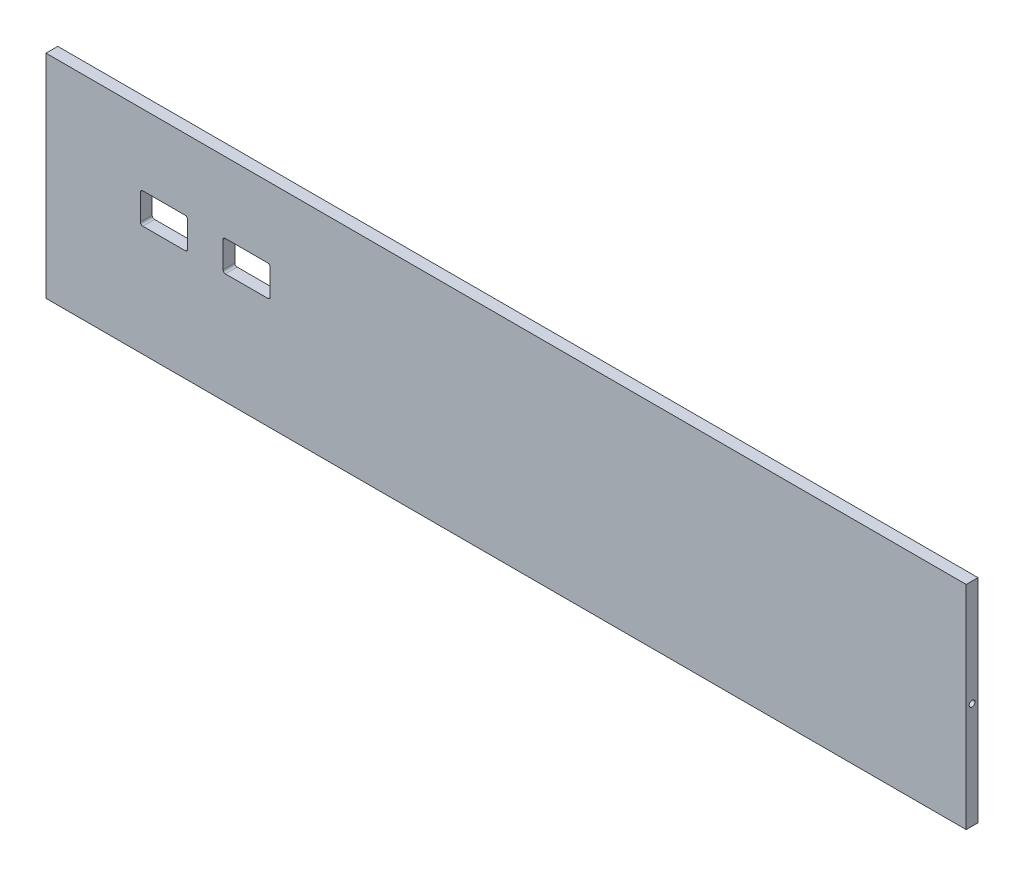
ISO-10303-21;
HEADER;
FILE_DESCRIPTION(('STEP AP214'),'2;1');
FILE_NAME('part.step','',(''),(''),'','','');
FILE_SCHEMA(('AUTOMOTIVE_DESIGN { 1 0 10303 214 1 1 1 1 }'));
ENDSEC;
DATA;
#1=APPLICATION_CONTEXT('core data for automotive mechanical design processes');
#2=APPLICATION_PROTOCOL_DEFINITION('international standard','automotive_design',2000,#1);
#3=PRODUCT_CONTEXT('',#1,'mechanical');
#4=PRODUCT('Part','Part','',(#3));
#5=PRODUCT_RELATED_PRODUCT_CATEGORY('part','',(#4));
#6=PRODUCT_DEFINITION_FORMATION('','',#4);
#7=PRODUCT_DEFINITION_CONTEXT('part definition',#1,'design');
#8=PRODUCT_DEFINITION('design','',#6,#7);
#9=PRODUCT_DEFINITION_SHAPE('','',#8);
#10=(LENGTH_UNIT() NAMED_UNIT(*) SI_UNIT(.MILLI.,.METRE.));
#11=(NAMED_UNIT(*) PLANE_ANGLE_UNIT() SI_UNIT($,.RADIAN.));
#12=(NAMED_UNIT(*) SI_UNIT($,.STERADIAN.) SOLID_ANGLE_UNIT());
#13=UNCERTAINTY_MEASURE_WITH_UNIT(LENGTH_MEASURE(1.E-05),#10,'distance_accuracy_value','');
#14=(GEOMETRIC_REPRESENTATION_CONTEXT(3) GLOBAL_UNCERTAINTY_ASSIGNED_CONTEXT((#13)) GLOBAL_UNIT_ASSIGNED_CONTEXT((#10,
#11,#12)) REPRESENTATION_CONTEXT('',''));
#15=CARTESIAN_POINT('',(0.,0.,0.));
#16=DIRECTION('',(0.,0.,1.));
#17=DIRECTION('',(1.,0.,0.));
#18=AXIS2_PLACEMENT_3D('',#15,#16,#17);
#19=CARTESIAN_POINT('',(0.,0.,5.));
#20=DIRECTION('',(0.,0.,-1.));
#21=DIRECTION('',(-1.,0.,0.));
#22=AXIS2_PLACEMENT_3D('',#19,#20,#21);
#23=PLANE('',#22);
#24=CARTESIAN_POINT('',(94.,48.,5.));
#25=DIRECTION('',(0.,0.,1.));
#26=DIRECTION('',(1.,0.,0.));
#27=AXIS2_PLACEMENT_3D('',#24,#25,#26);
#28=CIRCLE('',#27,1.);
#29=CARTESIAN_POINT('',(94.,47.,5.));
#30=VERTEX_POINT('',#29);
#31=CARTESIAN_POINT('',(95.,48.,5.));
#32=VERTEX_POINT('',#31);
#33=EDGE_CURVE('E268',#30,#32,#28,.T.);
#34=ORIENTED_EDGE('',*,*,#33,.F.);
#35=DIRECTION('',(1.,0.,0.));
#36=VECTOR('',#35,1.);
#37=CARTESIAN_POINT('',(76.,47.,5.));
#38=LINE('',#37,#36);
#39=CARTESIAN_POINT('',(76.,47.,5.));
#40=VERTEX_POINT('',#39);
#41=EDGE_CURVE('E291',#40,#30,#38,.T.);
#42=ORIENTED_EDGE('',*,*,#41,.F.);
#43=CARTESIAN_POINT('',(76.,48.,5.));
#44=DIRECTION('',(0.,0.,1.));
#45=DIRECTION('',(1.,0.,0.));
#46=AXIS2_PLACEMENT_3D('',#43,#44,#45);
#47=CIRCLE('',#46,1.);
#48=CARTESIAN_POINT('',(75.,48.,5.));
#49=VERTEX_POINT('',#48);
#50=EDGE_CURVE('E287',#49,#40,#47,.T.);
#51=ORIENTED_EDGE('',*,*,#50,.F.);
#52=DIRECTION('',(0.,-1.,0.));
#53=VECTOR('',#52,1.);
#54=CARTESIAN_POINT('',(75.,59.,5.));
#55=LINE('',#54,#53);
#56=CARTESIAN_POINT('',(75.,59.,5.));
#57=VERTEX_POINT('',#56);
#58=EDGE_CURVE('E284',#57,#49,#55,.T.);
#59=ORIENTED_EDGE('',*,*,#58,.F.);
#60=CARTESIAN_POINT('',(76.,59.,5.));
#61=DIRECTION('',(0.,0.,1.));
#62=DIRECTION('',(1.,0.,0.));
#63=AXIS2_PLACEMENT_3D('',#60,#61,#62);
#64=CIRCLE('',#63,1.);
#65=CARTESIAN_POINT('',(76.,60.,5.));
#66=VERTEX_POINT('',#65);
#67=EDGE_CURVE('E281',#66,#57,#64,.T.);
#68=ORIENTED_EDGE('',*,*,#67,.F.);
#69=DIRECTION('',(-1.,0.,0.));
#70=VECTOR('',#69,1.);
#71=CARTESIAN_POINT('',(76.,60.,5.));
#72=LINE('',#71,#70);
#73=CARTESIAN_POINT('',(94.,60.,5.));
#74=VERTEX_POINT('',#73);
#75=EDGE_CURVE('E278',#74,#66,#72,.T.);
#76=ORIENTED_EDGE('',*,*,#75,.F.);
#77=CARTESIAN_POINT('',(94.,59.,5.));
#78=DIRECTION('',(0.,0.,1.));
#79=DIRECTION('',(-1.,0.,0.));
#80=AXIS2_PLACEMENT_3D('',#77,#78,#79);
#81=CIRCLE('',#80,1.00000000000001);
#82=CARTESIAN_POINT('',(95.,59.,5.));
#83=VERTEX_POINT('',#82);
#84=EDGE_CURVE('E275',#83,#74,#81,.T.);
#85=ORIENTED_EDGE('',*,*,#84,.F.);
#86=DIRECTION('',(0.,1.,0.));
#87=VECTOR('',#86,1.);
#88=CARTESIAN_POINT('',(95.,59.,5.));
#89=LINE('',#88,#87);
#90=EDGE_CURVE('E271',#32,#83,#89,.T.);
#91=ORIENTED_EDGE('',*,*,#90,.F.);
#92=EDGE_LOOP('',(#34,#42,#51,#59,#68,#76,#85,#91));
#93=FACE_BOUND('',#92,.T.);
#94=DIRECTION('',(0.,-1.,0.));
#95=VECTOR('',#94,1.);
#96=CARTESIAN_POINT('',(0.,0.,5.));
#97=LINE('',#96,#95);
#98=CARTESIAN_POINT('',(0.,90.,5.));
#99=VERTEX_POINT('',#98);
#100=CARTESIAN_POINT('',(0.,0.,5.));
#101=VERTEX_POINT('',#100);
#102=EDGE_CURVE('E351',#99,#101,#97,.T.);
#103=ORIENTED_EDGE('',*,*,#102,.T.);
#104=DIRECTION('',(1.,0.,0.));
#105=VECTOR('',#104,1.);
#106=CARTESIAN_POINT('',(0.,0.,5.));
#107=LINE('',#106,#105);
#108=CARTESIAN_POINT('',(390.,0.,5.));
#109=VERTEX_POINT('',#108);
#110=EDGE_CURVE('E355',#101,#109,#107,.T.);
#111=ORIENTED_EDGE('',*,*,#110,.T.);
#112=DIRECTION('',(0.,1.,0.));
#113=VECTOR('',#112,1.);
#114=CARTESIAN_POINT('',(390.,0.,5.));
#115=LINE('',#114,#113);
#116=CARTESIAN_POINT('',(390.,90.,5.));
#117=VERTEX_POINT('',#116);
#118=EDGE_CURVE('E359',#109,#117,#115,.T.);
#119=ORIENTED_EDGE('',*,*,#118,.T.);
#120=DIRECTION('',(-1.,0.,0.));
#121=VECTOR('',#120,1.);
#122=CARTESIAN_POINT('',(0.,90.,5.));
#123=LINE('',#122,#121);
#124=EDGE_CURVE('E362',#117,#99,#123,.T.);
#125=ORIENTED_EDGE('',*,*,#124,.T.);
#126=EDGE_LOOP('',(#103,#111,#119,#125));
#127=FACE_BOUND('',#126,.T.);
#128=CARTESIAN_POINT('',(59.,59.,5.));
#129=DIRECTION('',(0.,0.,1.));
#130=DIRECTION('',(-1.,0.,0.));
#131=AXIS2_PLACEMENT_3D('',#128,#129,#130);
#132=CIRCLE('',#131,1.);
#133=CARTESIAN_POINT('',(60.,59.,5.));
#134=VERTEX_POINT('',#133);
#135=CARTESIAN_POINT('',(59.,60.,5.));
#136=VERTEX_POINT('',#135);
#137=EDGE_CURVE('E177',#134,#136,#132,.T.);
#138=ORIENTED_EDGE('',*,*,#137,.F.);
#139=DIRECTION('',(0.,1.,0.));
#140=VECTOR('',#139,1.);
#141=CARTESIAN_POINT('',(60.,59.,5.));
#142=LINE('',#141,#140);
#143=CARTESIAN_POINT('',(60.,48.,5.));
#144=VERTEX_POINT('',#143);
#145=EDGE_CURVE('E219',#144,#134,#142,.T.);
#146=ORIENTED_EDGE('',*,*,#145,.F.);
#147=CARTESIAN_POINT('',(59.,48.,5.));
#148=DIRECTION('',(0.,0.,1.));
#149=DIRECTION('',(1.,0.,0.));
#150=AXIS2_PLACEMENT_3D('',#147,#148,#149);
#151=CIRCLE('',#150,1.);
#152=CARTESIAN_POINT('',(59.,47.,5.));
#153=VERTEX_POINT('',#152);
#154=EDGE_CURVE('E216',#153,#144,#151,.T.);
#155=ORIENTED_EDGE('',*,*,#154,.F.);
#156=DIRECTION('',(1.,0.,0.));
#157=VECTOR('',#156,1.);
#158=CARTESIAN_POINT('',(41.,47.,5.));
#159=LINE('',#158,#157);
#160=CARTESIAN_POINT('',(41.,47.,5.));
#161=VERTEX_POINT('',#160);
#162=EDGE_CURVE('E213',#161,#153,#159,.T.);
#163=ORIENTED_EDGE('',*,*,#162,.F.);
#164=CARTESIAN_POINT('',(41.,48.,5.));
#165=DIRECTION('',(0.,0.,1.));
#166=DIRECTION('',(1.,0.,0.));
#167=AXIS2_PLACEMENT_3D('',#164,#165,#166);
#168=CIRCLE('',#167,1.);
#169=CARTESIAN_POINT('',(40.,48.,5.));
#170=VERTEX_POINT('',#169);
#171=EDGE_CURVE('E210',#170,#161,#168,.T.);
#172=ORIENTED_EDGE('',*,*,#171,.F.);
#173=DIRECTION('',(0.,-1.,0.));
#174=VECTOR('',#173,1.);
#175=CARTESIAN_POINT('',(40.,59.,5.));
#176=LINE('',#175,#174);
#177=CARTESIAN_POINT('',(40.,59.,5.));
#178=VERTEX_POINT('',#177);
#179=EDGE_CURVE('E204',#178,#170,#176,.T.);
#180=ORIENTED_EDGE('',*,*,#179,.F.);
#181=CARTESIAN_POINT('',(41.,59.,5.));
#182=DIRECTION('',(0.,0.,1.));
#183=DIRECTION('',(-1.,0.,0.));
#184=AXIS2_PLACEMENT_3D('',#181,#182,#183);
#185=CIRCLE('',#184,1.);
#186=CARTESIAN_POINT('',(41.,60.,5.));
#187=VERTEX_POINT('',#186);
#188=EDGE_CURVE('E200',#187,#178,#185,.T.);
#189=ORIENTED_EDGE('',*,*,#188,.F.);
#190=DIRECTION('',(-1.,0.,0.));
#191=VECTOR('',#190,1.);
#192=CARTESIAN_POINT('',(41.,60.,5.));
#193=LINE('',#192,#191);
#194=EDGE_CURVE('E186',#136,#187,#193,.T.);
#195=ORIENTED_EDGE('',*,*,#194,.F.);
#196=EDGE_LOOP('',(#138,#146,#155,#163,#172,#180,#189,#195));
#197=FACE_BOUND('',#196,.T.);
#198=ADVANCED_FACE('F39',(#93,#127,#197),#23,.F.);
#199=CARTESIAN_POINT('',(0.,0.,0.));
#200=DIRECTION('',(0.,0.,-1.));
#201=DIRECTION('',(-1.,0.,0.));
#202=AXIS2_PLACEMENT_3D('',#199,#200,#201);
#203=PLANE('',#202);
#204=DIRECTION('',(0.,-1.,0.));
#205=VECTOR('',#204,1.);
#206=CARTESIAN_POINT('',(0.,0.,0.));
#207=LINE('',#206,#205);
#208=CARTESIAN_POINT('',(0.,90.,0.));
#209=VERTEX_POINT('',#208);
#210=CARTESIAN_POINT('',(0.,0.,0.));
#211=VERTEX_POINT('',#210);
#212=EDGE_CURVE('E350',#209,#211,#207,.T.);
#213=ORIENTED_EDGE('',*,*,#212,.F.);
#214=DIRECTION('',(-1.,0.,0.));
#215=VECTOR('',#214,1.);
#216=CARTESIAN_POINT('',(0.,90.,0.));
#217=LINE('',#216,#215);
#218=CARTESIAN_POINT('',(390.,90.,0.));
#219=VERTEX_POINT('',#218);
#220=EDGE_CURVE('E356',#219,#209,#217,.T.);
#221=ORIENTED_EDGE('',*,*,#220,.F.);
#222=DIRECTION('',(0.,1.,0.));
#223=VECTOR('',#222,1.);
#224=CARTESIAN_POINT('',(390.,0.,0.));
#225=LINE('',#224,#223);
#226=CARTESIAN_POINT('',(390.,0.,0.));
#227=VERTEX_POINT('',#226);
#228=EDGE_CURVE('E372',#227,#219,#225,.T.);
#229=ORIENTED_EDGE('',*,*,#228,.F.);
#230=DIRECTION('',(1.,0.,0.));
#231=VECTOR('',#230,1.);
#232=CARTESIAN_POINT('',(0.,0.,0.));
#233=LINE('',#232,#231);
#234=EDGE_CURVE('E369',#211,#227,#233,.T.);
#235=ORIENTED_EDGE('',*,*,#234,.F.);
#236=EDGE_LOOP('',(#213,#221,#229,#235));
#237=FACE_BOUND('',#236,.T.);
#238=DIRECTION('',(1.,0.,0.));
#239=VECTOR('',#238,1.);
#240=CARTESIAN_POINT('',(76.,47.,0.));
#241=LINE('',#240,#239);
#242=CARTESIAN_POINT('',(76.,47.,0.));
#243=VERTEX_POINT('',#242);
#244=CARTESIAN_POINT('',(94.,47.,0.));
#245=VERTEX_POINT('',#244);
#246=EDGE_CURVE('E272',#243,#245,#241,.T.);
#247=ORIENTED_EDGE('',*,*,#246,.T.);
#248=CARTESIAN_POINT('',(94.,48.,0.));
#249=DIRECTION('',(0.,0.,1.));
#250=DIRECTION('',(1.,0.,0.));
#251=AXIS2_PLACEMENT_3D('',#248,#249,#250);
#252=CIRCLE('',#251,1.);
#253=CARTESIAN_POINT('',(95.,48.,0.));
#254=VERTEX_POINT('',#253);
#255=EDGE_CURVE('E195',#245,#254,#252,.T.);
#256=ORIENTED_EDGE('',*,*,#255,.T.);
#257=DIRECTION('',(0.,1.,0.));
#258=VECTOR('',#257,1.);
#259=CARTESIAN_POINT('',(95.,59.,0.));
#260=LINE('',#259,#258);
#261=CARTESIAN_POINT('',(95.,59.,0.));
#262=VERTEX_POINT('',#261);
#263=EDGE_CURVE('E298',#254,#262,#260,.T.);
#264=ORIENTED_EDGE('',*,*,#263,.T.);
#265=CARTESIAN_POINT('',(94.,59.,0.));
#266=DIRECTION('',(0.,0.,1.));
#267=DIRECTION('',(-1.,0.,0.));
#268=AXIS2_PLACEMENT_3D('',#265,#266,#267);
#269=CIRCLE('',#268,1.00000000000001);
#270=CARTESIAN_POINT('',(94.,60.,0.));
#271=VERTEX_POINT('',#270);
#272=EDGE_CURVE('E302',#262,#271,#269,.T.);
#273=ORIENTED_EDGE('',*,*,#272,.T.);
#274=DIRECTION('',(-1.,0.,0.));
#275=VECTOR('',#274,1.);
#276=CARTESIAN_POINT('',(76.,60.,0.));
#277=LINE('',#276,#275);
#278=CARTESIAN_POINT('',(76.,60.,0.));
#279=VERTEX_POINT('',#278);
#280=EDGE_CURVE('E306',#271,#279,#277,.T.);
#281=ORIENTED_EDGE('',*,*,#280,.T.);
#282=CARTESIAN_POINT('',(76.,59.,0.));
#283=DIRECTION('',(0.,0.,1.));
#284=DIRECTION('',(1.,0.,0.));
#285=AXIS2_PLACEMENT_3D('',#282,#283,#284);
#286=CIRCLE('',#285,1.);
#287=CARTESIAN_POINT('',(75.,59.,0.));
#288=VERTEX_POINT('',#287);
#289=EDGE_CURVE('E310',#279,#288,#286,.T.);
#290=ORIENTED_EDGE('',*,*,#289,.T.);
#291=DIRECTION('',(0.,-1.,0.));
#292=VECTOR('',#291,1.);
#293=CARTESIAN_POINT('',(75.,59.,0.));
#294=LINE('',#293,#292);
#295=CARTESIAN_POINT('',(75.,48.,0.));
#296=VERTEX_POINT('',#295);
#297=EDGE_CURVE('E314',#288,#296,#294,.T.);
#298=ORIENTED_EDGE('',*,*,#297,.T.);
#299=CARTESIAN_POINT('',(76.,48.,0.));
#300=DIRECTION('',(0.,0.,1.));
#301=DIRECTION('',(1.,0.,0.));
#302=AXIS2_PLACEMENT_3D('',#299,#300,#301);
#303=CIRCLE('',#302,1.);
#304=EDGE_CURVE('E318',#296,#243,#303,.T.);
#305=ORIENTED_EDGE('',*,*,#304,.T.);
#306=EDGE_LOOP('',(#247,#256,#264,#273,#281,#290,#298,#305));
#307=FACE_BOUND('',#306,.T.);
#308=DIRECTION('',(0.,1.,0.));
#309=VECTOR('',#308,1.);
#310=CARTESIAN_POINT('',(60.,59.,0.));
#311=LINE('',#310,#309);
#312=CARTESIAN_POINT('',(60.,48.,0.));
#313=VERTEX_POINT('',#312);
#314=CARTESIAN_POINT('',(60.,59.,0.));
#315=VERTEX_POINT('',#314);
#316=EDGE_CURVE('E187',#313,#315,#311,.T.);
#317=ORIENTED_EDGE('',*,*,#316,.T.);
#318=CARTESIAN_POINT('',(59.,59.,0.));
#319=DIRECTION('',(0.,0.,1.));
#320=DIRECTION('',(-1.,0.,0.));
#321=AXIS2_PLACEMENT_3D('',#318,#319,#320);
#322=CIRCLE('',#321,1.);
#323=CARTESIAN_POINT('',(59.,60.,0.));
#324=VERTEX_POINT('',#323);
#325=EDGE_CURVE('E63',#315,#324,#322,.T.);
#326=ORIENTED_EDGE('',*,*,#325,.T.);
#327=DIRECTION('',(-1.,0.,0.));
#328=VECTOR('',#327,1.);
#329=CARTESIAN_POINT('',(41.,60.,0.));
#330=LINE('',#329,#328);
#331=CARTESIAN_POINT('',(41.,60.,0.));
#332=VERTEX_POINT('',#331);
#333=EDGE_CURVE('E193',#324,#332,#330,.T.);
#334=ORIENTED_EDGE('',*,*,#333,.T.);
#335=CARTESIAN_POINT('',(41.,59.,0.));
#336=DIRECTION('',(0.,0.,1.));
#337=DIRECTION('',(-1.,0.,0.));
#338=AXIS2_PLACEMENT_3D('',#335,#336,#337);
#339=CIRCLE('',#338,1.);
#340=CARTESIAN_POINT('',(40.,59.,0.));
#341=VERTEX_POINT('',#340);
#342=EDGE_CURVE('E227',#332,#341,#339,.T.);
#343=ORIENTED_EDGE('',*,*,#342,.T.);
#344=DIRECTION('',(0.,-1.,0.));
#345=VECTOR('',#344,1.);
#346=CARTESIAN_POINT('',(40.,59.,0.));
#347=LINE('',#346,#345);
#348=CARTESIAN_POINT('',(40.,48.,0.));
#349=VERTEX_POINT('',#348);
#350=EDGE_CURVE('E231',#341,#349,#347,.T.);
#351=ORIENTED_EDGE('',*,*,#350,.T.);
#352=CARTESIAN_POINT('',(41.,48.,0.));
#353=DIRECTION('',(0.,0.,1.));
#354=DIRECTION('',(1.,0.,0.));
#355=AXIS2_PLACEMENT_3D('',#352,#353,#354);
#356=CIRCLE('',#355,1.);
#357=CARTESIAN_POINT('',(41.,47.,0.));
#358=VERTEX_POINT('',#357);
#359=EDGE_CURVE('E235',#349,#358,#356,.T.);
#360=ORIENTED_EDGE('',*,*,#359,.T.);
#361=DIRECTION('',(1.,0.,0.));
#362=VECTOR('',#361,1.);
#363=CARTESIAN_POINT('',(41.,47.,0.));
#364=LINE('',#363,#362);
#365=CARTESIAN_POINT('',(59.,47.,0.));
#366=VERTEX_POINT('',#365);
#367=EDGE_CURVE('E239',#358,#366,#364,.T.);
#368=ORIENTED_EDGE('',*,*,#367,.T.);
#369=CARTESIAN_POINT('',(59.,48.,0.));
#370=DIRECTION('',(0.,0.,1.));
#371=DIRECTION('',(1.,0.,0.));
#372=AXIS2_PLACEMENT_3D('',#369,#370,#371);
#373=CIRCLE('',#372,1.);
#374=EDGE_CURVE('E243',#366,#313,#373,.T.);
#375=ORIENTED_EDGE('',*,*,#374,.T.);
#376=EDGE_LOOP('',(#317,#326,#334,#343,#351,#360,#368,#375));
#377=FACE_BOUND('',#376,.T.);
#378=ADVANCED_FACE('F395',(#237,#307,#377),#203,.T.);
#379=CARTESIAN_POINT('',(0.,0.,5.));
#380=DIRECTION('',(1.,0.,0.));
#381=DIRECTION('',(0.,0.,-1.));
#382=AXIS2_PLACEMENT_3D('',#379,#380,#381);
#383=PLANE('',#382);
#384=CARTESIAN_POINT('',(0.,45.,2.5));
#385=DIRECTION('',(-1.,0.,0.));
#386=DIRECTION('',(0.,0.,1.));
#387=AXIS2_PLACEMENT_3D('',#384,#385,#386);
#388=CIRCLE('',#387,1.25);
#389=CARTESIAN_POINT('',(0.,45.,3.75));
#390=VERTEX_POINT('',#389);
#391=EDGE_CURVE('E716',#390,#390,#388,.T.);
#392=ORIENTED_EDGE('',*,*,#391,.F.);
#393=EDGE_LOOP('',(#392));
#394=FACE_BOUND('',#393,.T.);
#395=ORIENTED_EDGE('',*,*,#212,.T.);
#396=DIRECTION('',(0.,0.,-1.));
#397=VECTOR('',#396,1.);
#398=CARTESIAN_POINT('',(0.,0.,5.));
#399=LINE('',#398,#397);
#400=EDGE_CURVE('E11',#101,#211,#399,.T.);
#401=ORIENTED_EDGE('',*,*,#400,.F.);
#402=ORIENTED_EDGE('',*,*,#102,.F.);
#403=DIRECTION('',(0.,0.,-1.));
#404=VECTOR('',#403,1.);
#405=CARTESIAN_POINT('',(0.,90.,5.));
#406=LINE('',#405,#404);
#407=EDGE_CURVE('E365',#99,#209,#406,.T.);
#408=ORIENTED_EDGE('',*,*,#407,.T.);
#409=EDGE_LOOP('',(#395,#401,#402,#408));
#410=FACE_BOUND('',#409,.T.);
#411=ADVANCED_FACE('F41',(#394,#410),#383,.F.);
#412=CARTESIAN_POINT('',(0.,0.,5.));
#413=DIRECTION('',(0.,1.,0.));
#414=DIRECTION('',(0.,0.,1.));
#415=AXIS2_PLACEMENT_3D('',#412,#413,#414);
#416=PLANE('',#415);
#417=CARTESIAN_POINT('',(35.,0.,2.5));
#418=DIRECTION('',(0.,-1.,0.));
#419=DIRECTION('',(0.,0.,-1.));
#420=AXIS2_PLACEMENT_3D('',#417,#418,#419);
#421=CIRCLE('',#420,1.25);
#422=CARTESIAN_POINT('',(35.,0.,1.25));
#423=VERTEX_POINT('',#422);
#424=EDGE_CURVE('E696',#423,#423,#421,.T.);
#425=ORIENTED_EDGE('',*,*,#424,.F.);
#426=EDGE_LOOP('',(#425));
#427=FACE_BOUND('',#426,.T.);
#428=CARTESIAN_POINT('',(355.,0.,2.5));
#429=DIRECTION('',(0.,-1.,0.));
#430=DIRECTION('',(0.,0.,-1.));
#431=AXIS2_PLACEMENT_3D('',#428,#429,#430);
#432=CIRCLE('',#431,1.24999999999996);
#433=CARTESIAN_POINT('',(355.,0.,1.25000000000004));
#434=VERTEX_POINT('',#433);
#435=EDGE_CURVE('E710',#434,#434,#432,.T.);
#436=ORIENTED_EDGE('',*,*,#435,.F.);
#437=EDGE_LOOP('',(#436));
#438=FACE_BOUND('',#437,.T.);
#439=ORIENTED_EDGE('',*,*,#234,.T.);
#440=DIRECTION('',(0.,0.,-1.));
#441=VECTOR('',#440,1.);
#442=CARTESIAN_POINT('',(390.,0.,5.));
#443=LINE('',#442,#441);
#444=EDGE_CURVE('E48',#109,#227,#443,.T.);
#445=ORIENTED_EDGE('',*,*,#444,.F.);
#446=ORIENTED_EDGE('',*,*,#110,.F.);
#447=ORIENTED_EDGE('',*,*,#400,.T.);
#448=EDGE_LOOP('',(#439,#445,#446,#447));
#449=FACE_BOUND('',#448,.T.);
#450=ADVANCED_FACE('F405',(#427,#438,#449),#416,.F.);
#451=CARTESIAN_POINT('',(390.,0.,5.));
#452=DIRECTION('',(-1.,0.,0.));
#453=DIRECTION('',(0.,0.,1.));
#454=AXIS2_PLACEMENT_3D('',#451,#452,#453);
#455=PLANE('',#454);
#456=CARTESIAN_POINT('',(390.,45.,2.5));
#457=DIRECTION('',(1.,0.,0.));
#458=DIRECTION('',(0.,0.,-1.));
#459=AXIS2_PLACEMENT_3D('',#456,#457,#458);
#460=CIRCLE('',#459,1.25);
#461=CARTESIAN_POINT('',(390.,45.,1.25));
#462=VERTEX_POINT('',#461);
#463=EDGE_CURVE('E695',#462,#462,#460,.T.);
#464=ORIENTED_EDGE('',*,*,#463,.F.);
#465=EDGE_LOOP('',(#464));
#466=FACE_BOUND('',#465,.T.);
#467=ORIENTED_EDGE('',*,*,#228,.T.);
#468=DIRECTION('',(0.,0.,-1.));
#469=VECTOR('',#468,1.);
#470=CARTESIAN_POINT('',(390.,90.,5.));
#471=LINE('',#470,#469);
#472=EDGE_CURVE('E380',#117,#219,#471,.T.);
#473=ORIENTED_EDGE('',*,*,#472,.F.);
#474=ORIENTED_EDGE('',*,*,#118,.F.);
#475=ORIENTED_EDGE('',*,*,#444,.T.);
#476=EDGE_LOOP('',(#467,#473,#474,#475));
#477=FACE_BOUND('',#476,.T.);
#478=ADVANCED_FACE('F389',(#466,#477),#455,.F.);
#479=CARTESIAN_POINT('',(0.,90.,5.));
#480=DIRECTION('',(0.,-1.,0.));
#481=DIRECTION('',(0.,0.,-1.));
#482=AXIS2_PLACEMENT_3D('',#479,#480,#481);
#483=PLANE('',#482);
#484=ORIENTED_EDGE('',*,*,#220,.T.);
#485=ORIENTED_EDGE('',*,*,#407,.F.);
#486=ORIENTED_EDGE('',*,*,#124,.F.);
#487=ORIENTED_EDGE('',*,*,#472,.T.);
#488=EDGE_LOOP('',(#484,#485,#486,#487));
#489=FACE_BOUND('',#488,.T.);
#490=ADVANCED_FACE('F399',(#489),#483,.F.);
#491=CARTESIAN_POINT('',(94.,48.,5.));
#492=DIRECTION('',(0.,0.,-1.));
#493=DIRECTION('',(-1.,0.,0.));
#494=AXIS2_PLACEMENT_3D('',#491,#492,#493);
#495=CYLINDRICAL_SURFACE('',#494,1.);
#496=ORIENTED_EDGE('',*,*,#255,.F.);
#497=DIRECTION('',(0.,0.,-1.));
#498=VECTOR('',#497,1.);
#499=CARTESIAN_POINT('',(94.,47.,5.));
#500=LINE('',#499,#498);
#501=EDGE_CURVE('E294',#30,#245,#500,.T.);
#502=ORIENTED_EDGE('',*,*,#501,.F.);
#503=ORIENTED_EDGE('',*,*,#33,.T.);
#504=DIRECTION('',(0.,0.,-1.));
#505=VECTOR('',#504,1.);
#506=CARTESIAN_POINT('',(95.,48.,5.));
#507=LINE('',#506,#505);
#508=EDGE_CURVE('E346',#32,#254,#507,.T.);
#509=ORIENTED_EDGE('',*,*,#508,.T.);
#510=EDGE_LOOP('',(#496,#502,#503,#509));
#511=FACE_BOUND('',#510,.T.);
#512=ADVANCED_FACE('F426',(#511),#495,.F.);
#513=CARTESIAN_POINT('',(95.,59.,5.));
#514=DIRECTION('',(-1.,0.,0.));
#515=DIRECTION('',(0.,-1.,0.));
#516=AXIS2_PLACEMENT_3D('',#513,#514,#515);
#517=PLANE('',#516);
#518=ORIENTED_EDGE('',*,*,#263,.F.);
#519=ORIENTED_EDGE('',*,*,#508,.F.);
#520=ORIENTED_EDGE('',*,*,#90,.T.);
#521=DIRECTION('',(0.,0.,-1.));
#522=VECTOR('',#521,1.);
#523=CARTESIAN_POINT('',(95.,59.,5.));
#524=LINE('',#523,#522);
#525=EDGE_CURVE('E343',#83,#262,#524,.T.);
#526=ORIENTED_EDGE('',*,*,#525,.T.);
#527=EDGE_LOOP('',(#518,#519,#520,#526));
#528=FACE_BOUND('',#527,.T.);
#529=ADVANCED_FACE('F433',(#528),#517,.T.);
#530=CARTESIAN_POINT('',(94.,59.,5.));
#531=DIRECTION('',(0.,0.,-1.));
#532=DIRECTION('',(-1.,0.,0.));
#533=AXIS2_PLACEMENT_3D('',#530,#531,#532);
#534=CYLINDRICAL_SURFACE('',#533,1.00000000000001);
#535=ORIENTED_EDGE('',*,*,#272,.F.);
#536=ORIENTED_EDGE('',*,*,#525,.F.);
#537=ORIENTED_EDGE('',*,*,#84,.T.);
#538=DIRECTION('',(0.,0.,-1.));
#539=VECTOR('',#538,1.);
#540=CARTESIAN_POINT('',(94.,60.,5.));
#541=LINE('',#540,#539);
#542=EDGE_CURVE('E340',#74,#271,#541,.T.);
#543=ORIENTED_EDGE('',*,*,#542,.T.);
#544=EDGE_LOOP('',(#535,#536,#537,#543));
#545=FACE_BOUND('',#544,.T.);
#546=ADVANCED_FACE('F438',(#545),#534,.F.);
#547=CARTESIAN_POINT('',(76.,60.,5.));
#548=DIRECTION('',(0.,-1.,0.));
#549=DIRECTION('',(0.,0.,-1.));
#550=AXIS2_PLACEMENT_3D('',#547,#548,#549);
#551=PLANE('',#550);
#552=ORIENTED_EDGE('',*,*,#280,.F.);
#553=ORIENTED_EDGE('',*,*,#542,.F.);
#554=ORIENTED_EDGE('',*,*,#75,.T.);
#555=DIRECTION('',(0.,0.,-1.));
#556=VECTOR('',#555,1.);
#557=CARTESIAN_POINT('',(76.,60.,5.));
#558=LINE('',#557,#556);
#559=EDGE_CURVE('E337',#66,#279,#558,.T.);
#560=ORIENTED_EDGE('',*,*,#559,.T.);
#561=EDGE_LOOP('',(#552,#553,#554,#560));
#562=FACE_BOUND('',#561,.T.);
#563=ADVANCED_FACE('F463',(#562),#551,.T.);
#564=CARTESIAN_POINT('',(76.,59.,5.));
#565=DIRECTION('',(0.,0.,-1.));
#566=DIRECTION('',(-1.,0.,0.));
#567=AXIS2_PLACEMENT_3D('',#564,#565,#566);
#568=CYLINDRICAL_SURFACE('',#567,1.);
#569=ORIENTED_EDGE('',*,*,#289,.F.);
#570=ORIENTED_EDGE('',*,*,#559,.F.);
#571=ORIENTED_EDGE('',*,*,#67,.T.);
#572=DIRECTION('',(0.,0.,-1.));
#573=VECTOR('',#572,1.);
#574=CARTESIAN_POINT('',(75.,59.,5.));
#575=LINE('',#574,#573);
#576=EDGE_CURVE('E334',#57,#288,#575,.T.);
#577=ORIENTED_EDGE('',*,*,#576,.T.);
#578=EDGE_LOOP('',(#569,#570,#571,#577));
#579=FACE_BOUND('',#578,.T.);
#580=ADVANCED_FACE('F468',(#579),#568,.F.);
#581=CARTESIAN_POINT('',(75.,59.,5.));
#582=DIRECTION('',(1.,0.,0.));
#583=DIRECTION('',(0.,0.,-1.));
#584=AXIS2_PLACEMENT_3D('',#581,#582,#583);
#585=PLANE('',#584);
#586=ORIENTED_EDGE('',*,*,#297,.F.);
#587=ORIENTED_EDGE('',*,*,#576,.F.);
#588=ORIENTED_EDGE('',*,*,#58,.T.);
#589=DIRECTION('',(0.,0.,-1.));
#590=VECTOR('',#589,1.);
#591=CARTESIAN_POINT('',(75.,48.,5.));
#592=LINE('',#591,#590);
#593=EDGE_CURVE('E331',#49,#296,#592,.T.);
#594=ORIENTED_EDGE('',*,*,#593,.T.);
#595=EDGE_LOOP('',(#586,#587,#588,#594));
#596=FACE_BOUND('',#595,.T.);
#597=ADVANCED_FACE('F471',(#596),#585,.T.);
#598=CARTESIAN_POINT('',(76.,48.,5.));
#599=DIRECTION('',(0.,0.,-1.));
#600=DIRECTION('',(-1.,0.,0.));
#601=AXIS2_PLACEMENT_3D('',#598,#599,#600);
#602=CYLINDRICAL_SURFACE('',#601,1.);
#603=ORIENTED_EDGE('',*,*,#304,.F.);
#604=ORIENTED_EDGE('',*,*,#593,.F.);
#605=ORIENTED_EDGE('',*,*,#50,.T.);
#606=DIRECTION('',(0.,0.,-1.));
#607=VECTOR('',#606,1.);
#608=CARTESIAN_POINT('',(76.,47.,5.));
#609=LINE('',#608,#607);
#610=EDGE_CURVE('E328',#40,#243,#609,.T.);
#611=ORIENTED_EDGE('',*,*,#610,.T.);
#612=EDGE_LOOP('',(#603,#604,#605,#611));
#613=FACE_BOUND('',#612,.T.);
#614=ADVANCED_FACE('F451',(#613),#602,.F.);
#615=CARTESIAN_POINT('',(76.,47.,5.));
#616=DIRECTION('',(0.,1.,0.));
#617=DIRECTION('',(0.,0.,1.));
#618=AXIS2_PLACEMENT_3D('',#615,#616,#617);
#619=PLANE('',#618);
#620=ORIENTED_EDGE('',*,*,#246,.F.);
#621=ORIENTED_EDGE('',*,*,#610,.F.);
#622=ORIENTED_EDGE('',*,*,#41,.T.);
#623=ORIENTED_EDGE('',*,*,#501,.T.);
#624=EDGE_LOOP('',(#620,#621,#622,#623));
#625=FACE_BOUND('',#624,.T.);
#626=ADVANCED_FACE('F444',(#625),#619,.T.);
#627=CARTESIAN_POINT('',(59.,59.,5.));
#628=DIRECTION('',(0.,0.,-1.));
#629=DIRECTION('',(-1.,0.,0.));
#630=AXIS2_PLACEMENT_3D('',#627,#628,#629);
#631=CYLINDRICAL_SURFACE('',#630,1.);
#632=ORIENTED_EDGE('',*,*,#325,.F.);
#633=DIRECTION('',(0.,0.,-1.));
#634=VECTOR('',#633,1.);
#635=CARTESIAN_POINT('',(60.,59.,5.));
#636=LINE('',#635,#634);
#637=EDGE_CURVE('E181',#134,#315,#636,.T.);
#638=ORIENTED_EDGE('',*,*,#637,.F.);
#639=ORIENTED_EDGE('',*,*,#137,.T.);
#640=DIRECTION('',(0.,0.,-1.));
#641=VECTOR('',#640,1.);
#642=CARTESIAN_POINT('',(59.,60.,5.));
#643=LINE('',#642,#641);
#644=EDGE_CURVE('E180',#136,#324,#643,.T.);
#645=ORIENTED_EDGE('',*,*,#644,.T.);
#646=EDGE_LOOP('',(#632,#638,#639,#645));
#647=FACE_BOUND('',#646,.T.);
#648=ADVANCED_FACE('F179',(#647),#631,.F.);
#649=CARTESIAN_POINT('',(41.,60.,5.));
#650=DIRECTION('',(0.,-1.,0.));
#651=DIRECTION('',(0.,0.,-1.));
#652=AXIS2_PLACEMENT_3D('',#649,#650,#651);
#653=PLANE('',#652);
#654=ORIENTED_EDGE('',*,*,#333,.F.);
#655=ORIENTED_EDGE('',*,*,#644,.F.);
#656=ORIENTED_EDGE('',*,*,#194,.T.);
#657=DIRECTION('',(0.,0.,-1.));
#658=VECTOR('',#657,1.);
#659=CARTESIAN_POINT('',(41.,60.,5.));
#660=LINE('',#659,#658);
#661=EDGE_CURVE('E196',#187,#332,#660,.T.);
#662=ORIENTED_EDGE('',*,*,#661,.T.);
#663=EDGE_LOOP('',(#654,#655,#656,#662));
#664=FACE_BOUND('',#663,.T.);
#665=ADVANCED_FACE('F190',(#664),#653,.T.);
#666=CARTESIAN_POINT('',(41.,59.,5.));
#667=DIRECTION('',(0.,0.,-1.));
#668=DIRECTION('',(-1.,0.,0.));
#669=AXIS2_PLACEMENT_3D('',#666,#667,#668);
#670=CYLINDRICAL_SURFACE('',#669,1.);
#671=ORIENTED_EDGE('',*,*,#342,.F.);
#672=ORIENTED_EDGE('',*,*,#661,.F.);
#673=ORIENTED_EDGE('',*,*,#188,.T.);
#674=DIRECTION('',(0.,0.,-1.));
#675=VECTOR('',#674,1.);
#676=CARTESIAN_POINT('',(40.,59.,5.));
#677=LINE('',#676,#675);
#678=EDGE_CURVE('E263',#178,#341,#677,.T.);
#679=ORIENTED_EDGE('',*,*,#678,.T.);
#680=EDGE_LOOP('',(#671,#672,#673,#679));
#681=FACE_BOUND('',#680,.T.);
#682=ADVANCED_FACE('F531',(#681),#670,.F.);
#683=CARTESIAN_POINT('',(40.,59.,5.));
#684=DIRECTION('',(1.,0.,0.));
#685=DIRECTION('',(0.,0.,-1.));
#686=AXIS2_PLACEMENT_3D('',#683,#684,#685);
#687=PLANE('',#686);
#688=ORIENTED_EDGE('',*,*,#350,.F.);
#689=ORIENTED_EDGE('',*,*,#678,.F.);
#690=ORIENTED_EDGE('',*,*,#179,.T.);
#691=DIRECTION('',(0.,0.,-1.));
#692=VECTOR('',#691,1.);
#693=CARTESIAN_POINT('',(40.,48.,5.));
#694=LINE('',#693,#692);
#695=EDGE_CURVE('E260',#170,#349,#694,.T.);
#696=ORIENTED_EDGE('',*,*,#695,.T.);
#697=EDGE_LOOP('',(#688,#689,#690,#696));
#698=FACE_BOUND('',#697,.T.);
#699=ADVANCED_FACE('F540',(#698),#687,.T.);
#700=CARTESIAN_POINT('',(41.,48.,5.));
#701=DIRECTION('',(0.,0.,-1.));
#702=DIRECTION('',(-1.,0.,0.));
#703=AXIS2_PLACEMENT_3D('',#700,#701,#702);
#704=CYLINDRICAL_SURFACE('',#703,1.);
#705=ORIENTED_EDGE('',*,*,#359,.F.);
#706=ORIENTED_EDGE('',*,*,#695,.F.);
#707=ORIENTED_EDGE('',*,*,#171,.T.);
#708=DIRECTION('',(0.,0.,-1.));
#709=VECTOR('',#708,1.);
#710=CARTESIAN_POINT('',(41.,47.,5.));
#711=LINE('',#710,#709);
#712=EDGE_CURVE('E257',#161,#358,#711,.T.);
#713=ORIENTED_EDGE('',*,*,#712,.T.);
#714=EDGE_LOOP('',(#705,#706,#707,#713));
#715=FACE_BOUND('',#714,.T.);
#716=ADVANCED_FACE('F550',(#715),#704,.F.);
#717=CARTESIAN_POINT('',(41.,47.,5.));
#718=DIRECTION('',(0.,1.,0.));
#719=DIRECTION('',(0.,0.,1.));
#720=AXIS2_PLACEMENT_3D('',#717,#718,#719);
#721=PLANE('',#720);
#722=ORIENTED_EDGE('',*,*,#367,.F.);
#723=ORIENTED_EDGE('',*,*,#712,.F.);
#724=ORIENTED_EDGE('',*,*,#162,.T.);
#725=DIRECTION('',(0.,0.,-1.));
#726=VECTOR('',#725,1.);
#727=CARTESIAN_POINT('',(59.,47.,5.));
#728=LINE('',#727,#726);
#729=EDGE_CURVE('E254',#153,#366,#728,.T.);
#730=ORIENTED_EDGE('',*,*,#729,.T.);
#731=EDGE_LOOP('',(#722,#723,#724,#730));
#732=FACE_BOUND('',#731,.T.);
#733=ADVANCED_FACE('F560',(#732),#721,.T.);
#734=CARTESIAN_POINT('',(59.,48.,5.));
#735=DIRECTION('',(0.,0.,-1.));
#736=DIRECTION('',(-1.,0.,0.));
#737=AXIS2_PLACEMENT_3D('',#734,#735,#736);
#738=CYLINDRICAL_SURFACE('',#737,1.);
#739=ORIENTED_EDGE('',*,*,#374,.F.);
#740=ORIENTED_EDGE('',*,*,#729,.F.);
#741=ORIENTED_EDGE('',*,*,#154,.T.);
#742=DIRECTION('',(0.,0.,-1.));
#743=VECTOR('',#742,1.);
#744=CARTESIAN_POINT('',(60.,48.,5.));
#745=LINE('',#744,#743);
#746=EDGE_CURVE('E55',#144,#313,#745,.T.);
#747=ORIENTED_EDGE('',*,*,#746,.T.);
#748=EDGE_LOOP('',(#739,#740,#741,#747));
#749=FACE_BOUND('',#748,.T.);
#750=ADVANCED_FACE('F570',(#749),#738,.F.);
#751=CARTESIAN_POINT('',(60.,59.,5.));
#752=DIRECTION('',(-1.,0.,0.));
#753=DIRECTION('',(0.,0.,1.));
#754=AXIS2_PLACEMENT_3D('',#751,#752,#753);
#755=PLANE('',#754);
#756=ORIENTED_EDGE('',*,*,#316,.F.);
#757=ORIENTED_EDGE('',*,*,#746,.F.);
#758=ORIENTED_EDGE('',*,*,#145,.T.);
#759=ORIENTED_EDGE('',*,*,#637,.T.);
#760=EDGE_LOOP('',(#756,#757,#758,#759));
#761=FACE_BOUND('',#760,.T.);
#762=ADVANCED_FACE('F580',(#761),#755,.T.);
#763=CARTESIAN_POINT('',(15.,45.,2.5));
#764=DIRECTION('',(-1.,0.,0.));
#765=DIRECTION('',(0.,0.,1.));
#766=AXIS2_PLACEMENT_3D('',#763,#764,#765);
#767=CYLINDRICAL_SURFACE('',#766,1.25);
#768=CARTESIAN_POINT('',(15.,45.,2.5));
#769=DIRECTION('',(-1.,0.,0.));
#770=DIRECTION('',(0.,0.,1.));
#771=AXIS2_PLACEMENT_3D('',#768,#769,#770);
#772=CIRCLE('',#771,1.25);
#773=CARTESIAN_POINT('',(15.,45.,3.75));
#774=VERTEX_POINT('',#773);
#775=EDGE_CURVE('E224',#774,#774,#772,.T.);
#776=ORIENTED_EDGE('',*,*,#775,.F.);
#777=EDGE_LOOP('',(#776));
#778=FACE_BOUND('',#777,.T.);
#779=ORIENTED_EDGE('',*,*,#391,.T.);
#780=EDGE_LOOP('',(#779));
#781=FACE_BOUND('',#780,.T.);
#782=ADVANCED_FACE('F590',(#778,#781),#767,.F.);
#783=CARTESIAN_POINT('',(15.,45.,2.5));
#784=DIRECTION('',(-1.,0.,0.));
#785=DIRECTION('',(0.,0.,1.));
#786=AXIS2_PLACEMENT_3D('',#783,#784,#785);
#787=PLANE('',#786);
#788=ORIENTED_EDGE('',*,*,#775,.T.);
#789=EDGE_LOOP('',(#788));
#790=FACE_BOUND('',#789,.T.);
#791=ADVANCED_FACE('F607',(#790),#787,.T.);
#792=CARTESIAN_POINT('',(375.,45.,2.5));
#793=DIRECTION('',(1.,0.,0.));
#794=DIRECTION('',(0.,0.,-1.));
#795=AXIS2_PLACEMENT_3D('',#792,#793,#794);
#796=CYLINDRICAL_SURFACE('',#795,1.25);
#797=CARTESIAN_POINT('',(375.,45.,2.5));
#798=DIRECTION('',(1.,0.,0.));
#799=DIRECTION('',(0.,0.,-1.));
#800=AXIS2_PLACEMENT_3D('',#797,#798,#799);
#801=CIRCLE('',#800,1.25);
#802=CARTESIAN_POINT('',(375.,45.,1.25));
#803=VERTEX_POINT('',#802);
#804=EDGE_CURVE('E701',#803,#803,#801,.T.);
#805=ORIENTED_EDGE('',*,*,#804,.F.);
#806=EDGE_LOOP('',(#805));
#807=FACE_BOUND('',#806,.T.);
#808=ORIENTED_EDGE('',*,*,#463,.T.);
#809=EDGE_LOOP('',(#808));
#810=FACE_BOUND('',#809,.T.);
#811=ADVANCED_FACE('F617',(#807,#810),#796,.F.);
#812=CARTESIAN_POINT('',(375.,45.,2.5));
#813=DIRECTION('',(1.,0.,0.));
#814=DIRECTION('',(0.,0.,-1.));
#815=AXIS2_PLACEMENT_3D('',#812,#813,#814);
#816=PLANE('',#815);
#817=ORIENTED_EDGE('',*,*,#804,.T.);
#818=EDGE_LOOP('',(#817));
#819=FACE_BOUND('',#818,.T.);
#820=ADVANCED_FACE('F634',(#819),#816,.T.);
#821=CARTESIAN_POINT('',(355.,15.,2.5));
#822=DIRECTION('',(0.,-1.,0.));
#823=DIRECTION('',(0.,0.,-1.));
#824=AXIS2_PLACEMENT_3D('',#821,#822,#823);
#825=CYLINDRICAL_SURFACE('',#824,1.24999999999996);
#826=CARTESIAN_POINT('',(355.,15.,2.5));
#827=DIRECTION('',(0.,-1.,0.));
#828=DIRECTION('',(0.,0.,-1.));
#829=AXIS2_PLACEMENT_3D('',#826,#827,#828);
#830=CIRCLE('',#829,1.24999999999996);
#831=CARTESIAN_POINT('',(355.,15.,1.25000000000004));
#832=VERTEX_POINT('',#831);
#833=EDGE_CURVE('E704',#832,#832,#830,.T.);
#834=ORIENTED_EDGE('',*,*,#833,.F.);
#835=EDGE_LOOP('',(#834));
#836=FACE_BOUND('',#835,.T.);
#837=ORIENTED_EDGE('',*,*,#435,.T.);
#838=EDGE_LOOP('',(#837));
#839=FACE_BOUND('',#838,.T.);
#840=ADVANCED_FACE('F643',(#836,#839),#825,.F.);
#841=CARTESIAN_POINT('',(355.,15.,2.5));
#842=DIRECTION('',(0.,-1.,0.));
#843=DIRECTION('',(0.,0.,-1.));
#844=AXIS2_PLACEMENT_3D('',#841,#842,#843);
#845=PLANE('',#844);
#846=ORIENTED_EDGE('',*,*,#833,.T.);
#847=EDGE_LOOP('',(#846));
#848=FACE_BOUND('',#847,.T.);
#849=ADVANCED_FACE('F657',(#848),#845,.T.);
#850=CARTESIAN_POINT('',(35.,15.,2.5));
#851=DIRECTION('',(0.,-1.,0.));
#852=DIRECTION('',(0.,0.,-1.));
#853=AXIS2_PLACEMENT_3D('',#850,#851,#852);
#854=CYLINDRICAL_SURFACE('',#853,1.25);
#855=CARTESIAN_POINT('',(35.,15.,2.5));
#856=DIRECTION('',(0.,-1.,0.));
#857=DIRECTION('',(0.,0.,-1.));
#858=AXIS2_PLACEMENT_3D('',#855,#856,#857);
#859=CIRCLE('',#858,1.25);
#860=CARTESIAN_POINT('',(35.,15.,1.25));
#861=VERTEX_POINT('',#860);
#862=EDGE_CURVE('E693',#861,#861,#859,.T.);
#863=ORIENTED_EDGE('',*,*,#862,.F.);
#864=EDGE_LOOP('',(#863));
#865=FACE_BOUND('',#864,.T.);
#866=ORIENTED_EDGE('',*,*,#424,.T.);
#867=EDGE_LOOP('',(#866));
#868=FACE_BOUND('',#867,.T.);
#869=ADVANCED_FACE('F667',(#865,#868),#854,.F.);
#870=CARTESIAN_POINT('',(35.,15.,2.5));
#871=DIRECTION('',(0.,-1.,0.));
#872=DIRECTION('',(0.,0.,-1.));
#873=AXIS2_PLACEMENT_3D('',#870,#871,#872);
#874=PLANE('',#873);
#875=ORIENTED_EDGE('',*,*,#862,.T.);
#876=EDGE_LOOP('',(#875));
#877=FACE_BOUND('',#876,.T.);
#878=ADVANCED_FACE('F677',(#877),#874,.T.);
#879=CLOSED_SHELL('',(#198,#378,#411,#450,#478,#490,#512,#529,#546,#563,#580,#597,#614,#626,
#648,#665,#682,#699,#716,#733,#750,#762,#782,#791,#811,#820,#840,#849,#869,#878));
#880=MANIFOLD_SOLID_BREP('B2',#879);
#881=ADVANCED_BREP_SHAPE_REPRESENTATION('',(#18,#880),#14);
#882=SHAPE_DEFINITION_REPRESENTATION(#9,#881);
ENDSEC;
END-ISO-10303-21;
